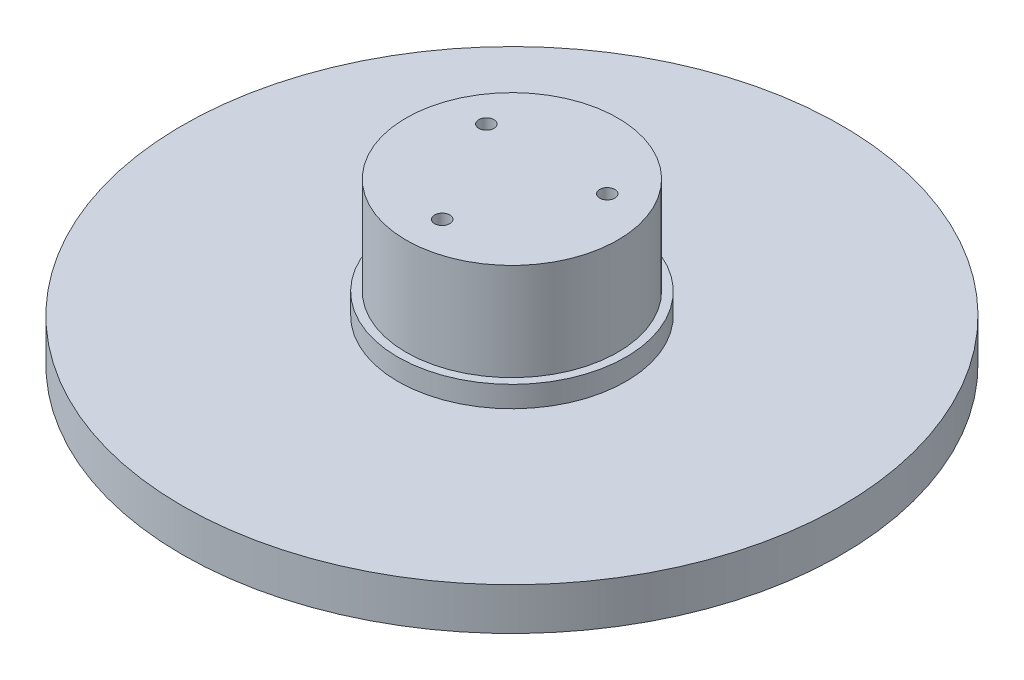
ISO-10303-21;
HEADER;
FILE_DESCRIPTION(('STEP AP214'),'2;1');
FILE_NAME('part.step','',(''),(''),'','','');
FILE_SCHEMA(('AUTOMOTIVE_DESIGN { 1 0 10303 214 1 1 1 1 }'));
ENDSEC;
DATA;
#1=APPLICATION_CONTEXT('core data for automotive mechanical design processes');
#2=APPLICATION_PROTOCOL_DEFINITION('international standard','automotive_design',2000,#1);
#3=PRODUCT_CONTEXT('',#1,'mechanical');
#4=PRODUCT('Part','Part','',(#3));
#5=PRODUCT_RELATED_PRODUCT_CATEGORY('part','',(#4));
#6=PRODUCT_DEFINITION_FORMATION('','',#4);
#7=PRODUCT_DEFINITION_CONTEXT('part definition',#1,'design');
#8=PRODUCT_DEFINITION('design','',#6,#7);
#9=PRODUCT_DEFINITION_SHAPE('','',#8);
#10=(LENGTH_UNIT() NAMED_UNIT(*) SI_UNIT(.MILLI.,.METRE.));
#11=(NAMED_UNIT(*) PLANE_ANGLE_UNIT() SI_UNIT($,.RADIAN.));
#12=(NAMED_UNIT(*) SI_UNIT($,.STERADIAN.) SOLID_ANGLE_UNIT());
#13=UNCERTAINTY_MEASURE_WITH_UNIT(LENGTH_MEASURE(1.E-05),#10,'distance_accuracy_value','');
#14=(GEOMETRIC_REPRESENTATION_CONTEXT(3) GLOBAL_UNCERTAINTY_ASSIGNED_CONTEXT((#13)) GLOBAL_UNIT_ASSIGNED_CONTEXT((#10,
#11,#12)) REPRESENTATION_CONTEXT('',''));
#15=CARTESIAN_POINT('',(0.,0.,0.));
#16=DIRECTION('',(0.,0.,1.));
#17=DIRECTION('',(1.,0.,0.));
#18=AXIS2_PLACEMENT_3D('',#15,#16,#17);
#19=CARTESIAN_POINT('',(0.,10.,0.));
#20=DIRECTION('',(0.,-1.,0.));
#21=DIRECTION('',(0.,0.,-1.));
#22=AXIS2_PLACEMENT_3D('',#19,#20,#21);
#23=CYLINDRICAL_SURFACE('',#22,78.);
#24=CARTESIAN_POINT('',(0.,10.,0.));
#25=DIRECTION('',(0.,1.,0.));
#26=DIRECTION('',(0.,0.,1.));
#27=AXIS2_PLACEMENT_3D('',#24,#25,#26);
#28=CIRCLE('',#27,78.);
#29=CARTESIAN_POINT('',(0.,10.,78.));
#30=VERTEX_POINT('',#29);
#31=EDGE_CURVE('E51',#30,#30,#28,.T.);
#32=ORIENTED_EDGE('',*,*,#31,.F.);
#33=EDGE_LOOP('',(#32));
#34=FACE_BOUND('',#33,.T.);
#35=CARTESIAN_POINT('',(0.,0.,0.));
#36=DIRECTION('',(0.,1.,0.));
#37=DIRECTION('',(0.,0.,1.));
#38=AXIS2_PLACEMENT_3D('',#35,#36,#37);
#39=CIRCLE('',#38,78.);
#40=CARTESIAN_POINT('',(0.,0.,78.));
#41=VERTEX_POINT('',#40);
#42=EDGE_CURVE('E42',#41,#41,#39,.T.);
#43=ORIENTED_EDGE('',*,*,#42,.T.);
#44=EDGE_LOOP('',(#43));
#45=FACE_BOUND('',#44,.T.);
#46=ADVANCED_FACE('F39',(#34,#45),#23,.T.);
#47=CARTESIAN_POINT('',(0.,10.,0.));
#48=DIRECTION('',(0.,1.,0.));
#49=DIRECTION('',(0.,0.,1.));
#50=AXIS2_PLACEMENT_3D('',#47,#48,#49);
#51=PLANE('',#50);
#52=CARTESIAN_POINT('',(0.,10.,0.));
#53=DIRECTION('',(0.,1.,0.));
#54=DIRECTION('',(0.,0.,1.));
#55=AXIS2_PLACEMENT_3D('',#52,#53,#54);
#56=CIRCLE('',#55,27.);
#57=CARTESIAN_POINT('',(0.,10.,27.));
#58=VERTEX_POINT('',#57);
#59=EDGE_CURVE('E46',#58,#58,#56,.T.);
#60=ORIENTED_EDGE('',*,*,#59,.F.);
#61=EDGE_LOOP('',(#60));
#62=FACE_BOUND('',#61,.T.);
#63=ORIENTED_EDGE('',*,*,#31,.T.);
#64=EDGE_LOOP('',(#63));
#65=FACE_BOUND('',#64,.T.);
#66=ADVANCED_FACE('F69',(#62,#65),#51,.T.);
#67=CARTESIAN_POINT('',(0.,0.,0.));
#68=DIRECTION('',(0.,1.,0.));
#69=DIRECTION('',(0.,0.,1.));
#70=AXIS2_PLACEMENT_3D('',#67,#68,#69);
#71=PLANE('',#70);
#72=CARTESIAN_POINT('',(0.,0.,16.51));
#73=DIRECTION('',(0.,-1.,0.));
#74=DIRECTION('',(0.,0.,-1.));
#75=AXIS2_PLACEMENT_3D('',#72,#73,#74);
#76=CIRCLE('',#75,3.275);
#77=CARTESIAN_POINT('',(0.,0.,13.235));
#78=VERTEX_POINT('',#77);
#79=EDGE_CURVE('E252',#78,#78,#76,.T.);
#80=ORIENTED_EDGE('',*,*,#79,.F.);
#81=EDGE_LOOP('',(#80));
#82=FACE_BOUND('',#81,.T.);
#83=CARTESIAN_POINT('',(14.2980794164811,0.,-8.25499999999996));
#84=DIRECTION('',(0.,-1.,0.));
#85=DIRECTION('',(0.,0.,-1.));
#86=AXIS2_PLACEMENT_3D('',#83,#84,#85);
#87=CIRCLE('',#86,3.275);
#88=CARTESIAN_POINT('',(14.2980794164811,0.,-11.53));
#89=VERTEX_POINT('',#88);
#90=EDGE_CURVE('E265',#89,#89,#87,.T.);
#91=ORIENTED_EDGE('',*,*,#90,.F.);
#92=EDGE_LOOP('',(#91));
#93=FACE_BOUND('',#92,.T.);
#94=CARTESIAN_POINT('',(-14.298079416481,0.,-8.25500000000007));
#95=DIRECTION('',(0.,-1.,0.));
#96=DIRECTION('',(0.,0.,-1.));
#97=AXIS2_PLACEMENT_3D('',#94,#95,#96);
#98=CIRCLE('',#97,3.275);
#99=CARTESIAN_POINT('',(-14.298079416481,0.,-11.5300000000001));
#100=VERTEX_POINT('',#99);
#101=EDGE_CURVE('E280',#100,#100,#98,.T.);
#102=ORIENTED_EDGE('',*,*,#101,.F.);
#103=EDGE_LOOP('',(#102));
#104=FACE_BOUND('',#103,.T.);
#105=ORIENTED_EDGE('',*,*,#42,.F.);
#106=EDGE_LOOP('',(#105));
#107=FACE_BOUND('',#106,.T.);
#108=ADVANCED_FACE('F66',(#82,#93,#104,#107),#71,.F.);
#109=CARTESIAN_POINT('',(0.,15.,0.));
#110=DIRECTION('',(0.,-1.,0.));
#111=DIRECTION('',(0.,0.,-1.));
#112=AXIS2_PLACEMENT_3D('',#109,#110,#111);
#113=CYLINDRICAL_SURFACE('',#112,27.);
#114=CARTESIAN_POINT('',(0.,15.,0.));
#115=DIRECTION('',(0.,1.,0.));
#116=DIRECTION('',(0.,0.,1.));
#117=AXIS2_PLACEMENT_3D('',#114,#115,#116);
#118=CIRCLE('',#117,27.);
#119=CARTESIAN_POINT('',(0.,15.,27.));
#120=VERTEX_POINT('',#119);
#121=EDGE_CURVE('E57',#120,#120,#118,.T.);
#122=ORIENTED_EDGE('',*,*,#121,.F.);
#123=EDGE_LOOP('',(#122));
#124=FACE_BOUND('',#123,.T.);
#125=ORIENTED_EDGE('',*,*,#59,.T.);
#126=EDGE_LOOP('',(#125));
#127=FACE_BOUND('',#126,.T.);
#128=ADVANCED_FACE('F68',(#124,#127),#113,.T.);
#129=CARTESIAN_POINT('',(0.,15.,0.));
#130=DIRECTION('',(0.,1.,0.));
#131=DIRECTION('',(0.,0.,1.));
#132=AXIS2_PLACEMENT_3D('',#129,#130,#131);
#133=PLANE('',#132);
#134=CARTESIAN_POINT('',(0.,15.,0.));
#135=DIRECTION('',(0.,1.,0.));
#136=DIRECTION('',(0.,0.,1.));
#137=AXIS2_PLACEMENT_3D('',#134,#135,#136);
#138=CIRCLE('',#137,25.05);
#139=CARTESIAN_POINT('',(0.,15.,25.05));
#140=VERTEX_POINT('',#139);
#141=EDGE_CURVE('E10',#140,#140,#138,.T.);
#142=ORIENTED_EDGE('',*,*,#141,.F.);
#143=EDGE_LOOP('',(#142));
#144=FACE_BOUND('',#143,.T.);
#145=ORIENTED_EDGE('',*,*,#121,.T.);
#146=EDGE_LOOP('',(#145));
#147=FACE_BOUND('',#146,.T.);
#148=ADVANCED_FACE('F76',(#144,#147),#133,.T.);
#149=CARTESIAN_POINT('',(0.,38.,0.));
#150=DIRECTION('',(0.,-1.,0.));
#151=DIRECTION('',(0.,0.,-1.));
#152=AXIS2_PLACEMENT_3D('',#149,#150,#151);
#153=CYLINDRICAL_SURFACE('',#152,25.05);
#154=CARTESIAN_POINT('',(0.,38.,0.));
#155=DIRECTION('',(0.,1.,0.));
#156=DIRECTION('',(0.,0.,1.));
#157=AXIS2_PLACEMENT_3D('',#154,#155,#156);
#158=CIRCLE('',#157,25.05);
#159=CARTESIAN_POINT('',(0.,38.,25.05));
#160=VERTEX_POINT('',#159);
#161=EDGE_CURVE('E55',#160,#160,#158,.T.);
#162=ORIENTED_EDGE('',*,*,#161,.F.);
#163=EDGE_LOOP('',(#162));
#164=FACE_BOUND('',#163,.T.);
#165=ORIENTED_EDGE('',*,*,#141,.T.);
#166=EDGE_LOOP('',(#165));
#167=FACE_BOUND('',#166,.T.);
#168=ADVANCED_FACE('F104',(#164,#167),#153,.T.);
#169=CARTESIAN_POINT('',(0.,38.,0.));
#170=DIRECTION('',(0.,1.,0.));
#171=DIRECTION('',(0.,0.,1.));
#172=AXIS2_PLACEMENT_3D('',#169,#170,#171);
#173=PLANE('',#172);
#174=CARTESIAN_POINT('',(0.,38.,16.51));
#175=DIRECTION('',(0.,-1.,0.));
#176=DIRECTION('',(0.,0.,-1.));
#177=AXIS2_PLACEMENT_3D('',#174,#175,#176);
#178=CIRCLE('',#177,1.79999999999999);
#179=CARTESIAN_POINT('',(0.,38.,14.71));
#180=VERTEX_POINT('',#179);
#181=EDGE_CURVE('E262',#180,#180,#178,.T.);
#182=ORIENTED_EDGE('',*,*,#181,.T.);
#183=EDGE_LOOP('',(#182));
#184=FACE_BOUND('',#183,.T.);
#185=CARTESIAN_POINT('',(14.2980794164811,38.,-8.25499999999996));
#186=DIRECTION('',(0.,-1.,0.));
#187=DIRECTION('',(0.,0.,-1.));
#188=AXIS2_PLACEMENT_3D('',#185,#186,#187);
#189=CIRCLE('',#188,1.79999999999999);
#190=CARTESIAN_POINT('',(14.2980794164811,38.,-10.0549999999999));
#191=VERTEX_POINT('',#190);
#192=EDGE_CURVE('E277',#191,#191,#189,.T.);
#193=ORIENTED_EDGE('',*,*,#192,.T.);
#194=EDGE_LOOP('',(#193));
#195=FACE_BOUND('',#194,.T.);
#196=CARTESIAN_POINT('',(-14.298079416481,38.,-8.25500000000007));
#197=DIRECTION('',(0.,-1.,0.));
#198=DIRECTION('',(0.,0.,-1.));
#199=AXIS2_PLACEMENT_3D('',#196,#197,#198);
#200=CIRCLE('',#199,1.79999999999999);
#201=CARTESIAN_POINT('',(-14.298079416481,38.,-10.0550000000001));
#202=VERTEX_POINT('',#201);
#203=EDGE_CURVE('E291',#202,#202,#200,.T.);
#204=ORIENTED_EDGE('',*,*,#203,.T.);
#205=EDGE_LOOP('',(#204));
#206=FACE_BOUND('',#205,.T.);
#207=ORIENTED_EDGE('',*,*,#161,.T.);
#208=EDGE_LOOP('',(#207));
#209=FACE_BOUND('',#208,.T.);
#210=ADVANCED_FACE('F112',(#184,#195,#206,#209),#173,.T.);
#211=CARTESIAN_POINT('',(-14.298079416481,0.,-8.25500000000007));
#212=DIRECTION('',(0.,-1.,0.));
#213=DIRECTION('',(0.,0.,-1.));
#214=AXIS2_PLACEMENT_3D('',#211,#212,#213);
#215=CYLINDRICAL_SURFACE('',#214,1.79999999999999);
#216=ORIENTED_EDGE('',*,*,#203,.F.);
#217=EDGE_LOOP('',(#216));
#218=FACE_BOUND('',#217,.T.);
#219=CARTESIAN_POINT('',(-14.298079416481,23.,-8.25500000000007));
#220=DIRECTION('',(0.,-1.,0.));
#221=DIRECTION('',(0.,0.,-1.));
#222=AXIS2_PLACEMENT_3D('',#219,#220,#221);
#223=CIRCLE('',#222,1.8);
#224=CARTESIAN_POINT('',(-14.298079416481,23.,-10.0550000000001));
#225=VERTEX_POINT('',#224);
#226=EDGE_CURVE('E289',#225,#225,#223,.T.);
#227=ORIENTED_EDGE('',*,*,#226,.T.);
#228=EDGE_LOOP('',(#227));
#229=FACE_BOUND('',#228,.T.);
#230=ADVANCED_FACE('F124',(#218,#229),#215,.F.);
#231=CARTESIAN_POINT('',(-11.048079416481,23.,-8.25500000000007));
#232=DIRECTION('',(0.,1.,0.));
#233=DIRECTION('',(0.,0.,1.));
#234=AXIS2_PLACEMENT_3D('',#231,#232,#233);
#235=PLANE('',#234);
#236=ORIENTED_EDGE('',*,*,#226,.F.);
#237=EDGE_LOOP('',(#236));
#238=FACE_BOUND('',#237,.T.);
#239=CARTESIAN_POINT('',(-14.298079416481,23.,-8.25500000000007));
#240=DIRECTION('',(0.,-1.,0.));
#241=DIRECTION('',(0.,0.,-1.));
#242=AXIS2_PLACEMENT_3D('',#239,#240,#241);
#243=CIRCLE('',#242,3.25);
#244=CARTESIAN_POINT('',(-14.298079416481,23.,-11.5050000000001));
#245=VERTEX_POINT('',#244);
#246=EDGE_CURVE('E286',#245,#245,#243,.T.);
#247=ORIENTED_EDGE('',*,*,#246,.T.);
#248=EDGE_LOOP('',(#247));
#249=FACE_BOUND('',#248,.T.);
#250=ADVANCED_FACE('F134',(#238,#249),#235,.F.);
#251=CARTESIAN_POINT('',(-14.298079416481,0.,-8.25500000000007));
#252=DIRECTION('',(0.,-1.,0.));
#253=DIRECTION('',(0.,0.,-1.));
#254=AXIS2_PLACEMENT_3D('',#251,#252,#253);
#255=CYLINDRICAL_SURFACE('',#254,3.25);
#256=ORIENTED_EDGE('',*,*,#246,.F.);
#257=EDGE_LOOP('',(#256));
#258=FACE_BOUND('',#257,.T.);
#259=CARTESIAN_POINT('',(-14.298079416481,0.0250000000000006,-8.25500000000007));
#260=DIRECTION('',(0.,-1.,0.));
#261=DIRECTION('',(0.,0.,-1.));
#262=AXIS2_PLACEMENT_3D('',#259,#260,#261);
#263=CIRCLE('',#262,3.25);
#264=CARTESIAN_POINT('',(-14.298079416481,0.0250000000000006,-11.5050000000001));
#265=VERTEX_POINT('',#264);
#266=EDGE_CURVE('E283',#265,#265,#263,.T.);
#267=ORIENTED_EDGE('',*,*,#266,.T.);
#268=EDGE_LOOP('',(#267));
#269=FACE_BOUND('',#268,.T.);
#270=ADVANCED_FACE('F144',(#258,#269),#255,.F.);
#271=CARTESIAN_POINT('',(-14.298079416481,0.,-8.25500000000007));
#272=DIRECTION('',(0.,-1.,0.));
#273=DIRECTION('',(0.,0.,-1.));
#274=AXIS2_PLACEMENT_3D('',#271,#272,#273);
#275=CONICAL_SURFACE('',#274,3.275,0.785398163397451);
#276=ORIENTED_EDGE('',*,*,#266,.F.);
#277=EDGE_LOOP('',(#276));
#278=FACE_BOUND('',#277,.T.);
#279=ORIENTED_EDGE('',*,*,#101,.T.);
#280=EDGE_LOOP('',(#279));
#281=FACE_BOUND('',#280,.T.);
#282=ADVANCED_FACE('F154',(#278,#281),#275,.F.);
#283=CARTESIAN_POINT('',(14.2980794164811,0.,-8.25499999999996));
#284=DIRECTION('',(0.,-1.,0.));
#285=DIRECTION('',(0.,0.,-1.));
#286=AXIS2_PLACEMENT_3D('',#283,#284,#285);
#287=CYLINDRICAL_SURFACE('',#286,1.79999999999999);
#288=ORIENTED_EDGE('',*,*,#192,.F.);
#289=EDGE_LOOP('',(#288));
#290=FACE_BOUND('',#289,.T.);
#291=CARTESIAN_POINT('',(14.2980794164811,23.,-8.25499999999996));
#292=DIRECTION('',(0.,-1.,0.));
#293=DIRECTION('',(0.,0.,-1.));
#294=AXIS2_PLACEMENT_3D('',#291,#292,#293);
#295=CIRCLE('',#294,1.8);
#296=CARTESIAN_POINT('',(14.2980794164811,23.,-10.055));
#297=VERTEX_POINT('',#296);
#298=EDGE_CURVE('E274',#297,#297,#295,.T.);
#299=ORIENTED_EDGE('',*,*,#298,.T.);
#300=EDGE_LOOP('',(#299));
#301=FACE_BOUND('',#300,.T.);
#302=ADVANCED_FACE('F164',(#290,#301),#287,.F.);
#303=CARTESIAN_POINT('',(17.5480794164811,23.,-8.25499999999996));
#304=DIRECTION('',(0.,1.,0.));
#305=DIRECTION('',(0.,0.,1.));
#306=AXIS2_PLACEMENT_3D('',#303,#304,#305);
#307=PLANE('',#306);
#308=ORIENTED_EDGE('',*,*,#298,.F.);
#309=EDGE_LOOP('',(#308));
#310=FACE_BOUND('',#309,.T.);
#311=CARTESIAN_POINT('',(14.2980794164811,23.,-8.25499999999996));
#312=DIRECTION('',(0.,-1.,0.));
#313=DIRECTION('',(0.,0.,-1.));
#314=AXIS2_PLACEMENT_3D('',#311,#312,#313);
#315=CIRCLE('',#314,3.25);
#316=CARTESIAN_POINT('',(14.2980794164811,23.,-11.505));
#317=VERTEX_POINT('',#316);
#318=EDGE_CURVE('E271',#317,#317,#315,.T.);
#319=ORIENTED_EDGE('',*,*,#318,.T.);
#320=EDGE_LOOP('',(#319));
#321=FACE_BOUND('',#320,.T.);
#322=ADVANCED_FACE('F174',(#310,#321),#307,.F.);
#323=CARTESIAN_POINT('',(14.2980794164811,0.,-8.25499999999996));
#324=DIRECTION('',(0.,-1.,0.));
#325=DIRECTION('',(0.,0.,-1.));
#326=AXIS2_PLACEMENT_3D('',#323,#324,#325);
#327=CYLINDRICAL_SURFACE('',#326,3.25);
#328=ORIENTED_EDGE('',*,*,#318,.F.);
#329=EDGE_LOOP('',(#328));
#330=FACE_BOUND('',#329,.T.);
#331=CARTESIAN_POINT('',(14.2980794164811,0.0250000000000006,-8.25499999999996));
#332=DIRECTION('',(0.,-1.,0.));
#333=DIRECTION('',(0.,0.,-1.));
#334=AXIS2_PLACEMENT_3D('',#331,#332,#333);
#335=CIRCLE('',#334,3.25);
#336=CARTESIAN_POINT('',(14.2980794164811,0.0250000000000006,-11.505));
#337=VERTEX_POINT('',#336);
#338=EDGE_CURVE('E268',#337,#337,#335,.T.);
#339=ORIENTED_EDGE('',*,*,#338,.T.);
#340=EDGE_LOOP('',(#339));
#341=FACE_BOUND('',#340,.T.);
#342=ADVANCED_FACE('F184',(#330,#341),#327,.F.);
#343=CARTESIAN_POINT('',(14.2980794164811,0.,-8.25499999999996));
#344=DIRECTION('',(0.,-1.,0.));
#345=DIRECTION('',(0.,0.,-1.));
#346=AXIS2_PLACEMENT_3D('',#343,#344,#345);
#347=CONICAL_SURFACE('',#346,3.275,0.785398163397451);
#348=ORIENTED_EDGE('',*,*,#338,.F.);
#349=EDGE_LOOP('',(#348));
#350=FACE_BOUND('',#349,.T.);
#351=ORIENTED_EDGE('',*,*,#90,.T.);
#352=EDGE_LOOP('',(#351));
#353=FACE_BOUND('',#352,.T.);
#354=ADVANCED_FACE('F194',(#350,#353),#347,.F.);
#355=CARTESIAN_POINT('',(0.,0.,16.51));
#356=DIRECTION('',(0.,-1.,0.));
#357=DIRECTION('',(0.,0.,-1.));
#358=AXIS2_PLACEMENT_3D('',#355,#356,#357);
#359=CYLINDRICAL_SURFACE('',#358,1.79999999999999);
#360=ORIENTED_EDGE('',*,*,#181,.F.);
#361=EDGE_LOOP('',(#360));
#362=FACE_BOUND('',#361,.T.);
#363=CARTESIAN_POINT('',(0.,23.,16.51));
#364=DIRECTION('',(0.,-1.,0.));
#365=DIRECTION('',(0.,0.,-1.));
#366=AXIS2_PLACEMENT_3D('',#363,#364,#365);
#367=CIRCLE('',#366,1.8);
#368=CARTESIAN_POINT('',(0.,23.,14.71));
#369=VERTEX_POINT('',#368);
#370=EDGE_CURVE('E259',#369,#369,#367,.T.);
#371=ORIENTED_EDGE('',*,*,#370,.T.);
#372=EDGE_LOOP('',(#371));
#373=FACE_BOUND('',#372,.T.);
#374=ADVANCED_FACE('F204',(#362,#373),#359,.F.);
#375=CARTESIAN_POINT('',(3.25,23.,16.51));
#376=DIRECTION('',(0.,1.,0.));
#377=DIRECTION('',(0.,0.,1.));
#378=AXIS2_PLACEMENT_3D('',#375,#376,#377);
#379=PLANE('',#378);
#380=ORIENTED_EDGE('',*,*,#370,.F.);
#381=EDGE_LOOP('',(#380));
#382=FACE_BOUND('',#381,.T.);
#383=CARTESIAN_POINT('',(0.,23.,16.51));
#384=DIRECTION('',(0.,-1.,0.));
#385=DIRECTION('',(0.,0.,-1.));
#386=AXIS2_PLACEMENT_3D('',#383,#384,#385);
#387=CIRCLE('',#386,3.25);
#388=CARTESIAN_POINT('',(0.,23.,13.26));
#389=VERTEX_POINT('',#388);
#390=EDGE_CURVE('E254',#389,#389,#387,.T.);
#391=ORIENTED_EDGE('',*,*,#390,.T.);
#392=EDGE_LOOP('',(#391));
#393=FACE_BOUND('',#392,.T.);
#394=ADVANCED_FACE('F214',(#382,#393),#379,.F.);
#395=CARTESIAN_POINT('',(0.,0.,16.51));
#396=DIRECTION('',(0.,-1.,0.));
#397=DIRECTION('',(0.,0.,-1.));
#398=AXIS2_PLACEMENT_3D('',#395,#396,#397);
#399=CYLINDRICAL_SURFACE('',#398,3.25);
#400=ORIENTED_EDGE('',*,*,#390,.F.);
#401=EDGE_LOOP('',(#400));
#402=FACE_BOUND('',#401,.T.);
#403=CARTESIAN_POINT('',(0.,0.0250000000000006,16.51));
#404=DIRECTION('',(0.,-1.,0.));
#405=DIRECTION('',(0.,0.,-1.));
#406=AXIS2_PLACEMENT_3D('',#403,#404,#405);
#407=CIRCLE('',#406,3.25);
#408=CARTESIAN_POINT('',(0.,0.0250000000000006,13.26));
#409=VERTEX_POINT('',#408);
#410=EDGE_CURVE('E250',#409,#409,#407,.T.);
#411=ORIENTED_EDGE('',*,*,#410,.T.);
#412=EDGE_LOOP('',(#411));
#413=FACE_BOUND('',#412,.T.);
#414=ADVANCED_FACE('F224',(#402,#413),#399,.F.);
#415=CARTESIAN_POINT('',(0.,0.,16.51));
#416=DIRECTION('',(0.,-1.,0.));
#417=DIRECTION('',(0.,0.,-1.));
#418=AXIS2_PLACEMENT_3D('',#415,#416,#417);
#419=CONICAL_SURFACE('',#418,3.275,0.785398163397451);
#420=ORIENTED_EDGE('',*,*,#410,.F.);
#421=EDGE_LOOP('',(#420));
#422=FACE_BOUND('',#421,.T.);
#423=ORIENTED_EDGE('',*,*,#79,.T.);
#424=EDGE_LOOP('',(#423));
#425=FACE_BOUND('',#424,.T.);
#426=ADVANCED_FACE('F234',(#422,#425),#419,.F.);
#427=CLOSED_SHELL('',(#46,#66,#108,#128,#148,#168,#210,#230,#250,#270,#282,#302,#322,#342,#354,
#374,#394,#414,#426));
#428=MANIFOLD_SOLID_BREP('B2',#427);
#429=ADVANCED_BREP_SHAPE_REPRESENTATION('',(#18,#428),#14);
#430=SHAPE_DEFINITION_REPRESENTATION(#9,#429);
ENDSEC;
END-ISO-10303-21;
